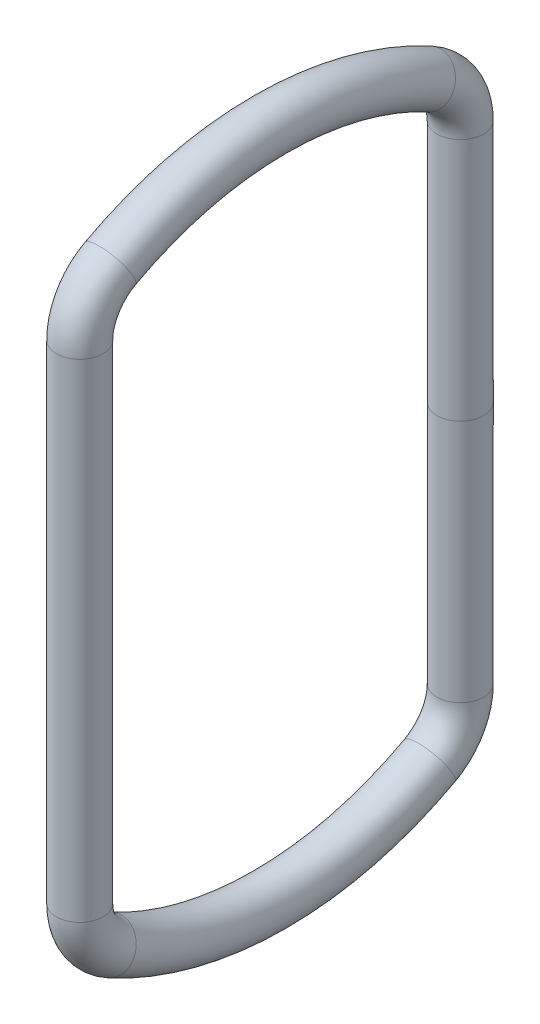
ISO-10303-21;
HEADER;
FILE_DESCRIPTION(('STEP AP214'),'2;1');
FILE_NAME('part.step','',(''),(''),'','','');
FILE_SCHEMA(('AUTOMOTIVE_DESIGN { 1 0 10303 214 1 1 1 1 }'));
ENDSEC;
DATA;
#1=APPLICATION_CONTEXT('core data for automotive mechanical design processes');
#2=APPLICATION_PROTOCOL_DEFINITION('international standard','automotive_design',2000,#1);
#3=PRODUCT_CONTEXT('',#1,'mechanical');
#4=PRODUCT('Part','Part','',(#3));
#5=PRODUCT_RELATED_PRODUCT_CATEGORY('part','',(#4));
#6=PRODUCT_DEFINITION_FORMATION('','',#4);
#7=PRODUCT_DEFINITION_CONTEXT('part definition',#1,'design');
#8=PRODUCT_DEFINITION('design','',#6,#7);
#9=PRODUCT_DEFINITION_SHAPE('','',#8);
#10=(LENGTH_UNIT() NAMED_UNIT(*) SI_UNIT(.MILLI.,.METRE.));
#11=(NAMED_UNIT(*) PLANE_ANGLE_UNIT() SI_UNIT($,.RADIAN.));
#12=(NAMED_UNIT(*) SI_UNIT($,.STERADIAN.) SOLID_ANGLE_UNIT());
#13=UNCERTAINTY_MEASURE_WITH_UNIT(LENGTH_MEASURE(1.E-05),#10,'distance_accuracy_value','');
#14=(GEOMETRIC_REPRESENTATION_CONTEXT(3) GLOBAL_UNCERTAINTY_ASSIGNED_CONTEXT((#13)) GLOBAL_UNIT_ASSIGNED_CONTEXT((#10,
#11,#12)) REPRESENTATION_CONTEXT('',''));
#15=CARTESIAN_POINT('',(0.,0.,0.));
#16=DIRECTION('',(0.,0.,1.));
#17=DIRECTION('',(1.,0.,0.));
#18=AXIS2_PLACEMENT_3D('',#15,#16,#17);
#19=CARTESIAN_POINT('',(0.,-4.17790617414992,-3.26));
#20=DIRECTION('',(0.,1.,0.));
#21=DIRECTION('',(0.,0.,1.));
#22=AXIS2_PLACEMENT_3D('',#19,#20,#21);
#23=CYLINDRICAL_SURFACE('',#22,0.4);
#24=CARTESIAN_POINT('',(0.,0.,-3.26));
#25=DIRECTION('',(0.,1.,0.));
#26=DIRECTION('',(0.,0.,1.));
#27=AXIS2_PLACEMENT_3D('',#24,#25,#26);
#28=CIRCLE('',#27,0.4);
#29=CARTESIAN_POINT('',(0.,0.,-2.86));
#30=VERTEX_POINT('',#29);
#31=EDGE_CURVE('E62',#30,#30,#28,.T.);
#32=ORIENTED_EDGE('',*,*,#31,.F.);
#33=EDGE_LOOP('',(#32));
#34=FACE_BOUND('',#33,.T.);
#35=CARTESIAN_POINT('',(0.,-4.17790617414991,-3.26));
#36=DIRECTION('',(0.,1.,0.));
#37=DIRECTION('',(0.,0.,1.));
#38=AXIS2_PLACEMENT_3D('',#35,#36,#37);
#39=CIRCLE('',#38,0.4);
#40=CARTESIAN_POINT('',(0.,-4.17790617414991,-3.66));
#41=VERTEX_POINT('',#40);
#42=EDGE_CURVE('E10',#41,#41,#39,.T.);
#43=ORIENTED_EDGE('',*,*,#42,.T.);
#44=EDGE_LOOP('',(#43));
#45=FACE_BOUND('',#44,.T.);
#46=ADVANCED_FACE('F31',(#34,#45),#23,.T.);
#47=CARTESIAN_POINT('',(0.,-4.17790617414992,-2.26));
#48=DIRECTION('',(1.,0.,0.));
#49=DIRECTION('',(0.,0.,-1.));
#50=AXIS2_PLACEMENT_3D('',#47,#48,#49);
#51=TOROIDAL_SURFACE('',#50,0.999999999999999,0.4);
#52=CARTESIAN_POINT('',(0.,-5.0574653687078,-2.73578947368421));
#53=DIRECTION('',(0.,0.47578947368421,-0.879559194557877));
#54=DIRECTION('',(0.,0.879559194557877,0.47578947368421));
#55=AXIS2_PLACEMENT_3D('',#52,#53,#54);
#56=CIRCLE('',#55,0.4);
#57=CARTESIAN_POINT('',(0.,-5.40928904653095,-2.92610526315789));
#58=VERTEX_POINT('',#57);
#59=EDGE_CURVE('E37',#58,#58,#56,.T.);
#60=CARTESIAN_POINT('',(0.,-4.17790617414992,-2.26));
#61=DIRECTION('',(1.,0.,0.));
#62=DIRECTION('',(0.,0.,-1.));
#63=AXIS2_PLACEMENT_3D('',#60,#61,#62);
#64=CIRCLE('',#63,1.4);
#65=EDGE_CURVE('',#58,#41,#64,.T.);
#66=ORIENTED_EDGE('',*,*,#59,.T.);
#67=ORIENTED_EDGE('',*,*,#42,.F.);
#68=ORIENTED_EDGE('',*,*,#65,.T.);
#69=ORIENTED_EDGE('',*,*,#65,.F.);
#70=EDGE_LOOP('',(#66,#68,#67,#69));
#71=FACE_BOUND('',#70,.T.);
#72=ADVANCED_FACE('F69',(#71),#51,.T.);
#73=CARTESIAN_POINT('',(0.,0.,0.));
#74=DIRECTION('',(1.,0.,0.));
#75=DIRECTION('',(0.,0.,-1.));
#76=AXIS2_PLACEMENT_3D('',#73,#74,#75);
#77=TOROIDAL_SURFACE('',#76,5.75,0.4);
#78=CARTESIAN_POINT('',(0.,-5.05746536870779,2.73578947368422));
#79=DIRECTION('',(0.,-0.475789473684216,-0.879559194557875));
#80=DIRECTION('',(0.,0.879559194557875,-0.475789473684216));
#81=AXIS2_PLACEMENT_3D('',#78,#79,#80);
#82=CIRCLE('',#81,0.4);
#83=CARTESIAN_POINT('',(0.,-5.40928904653094,2.9261052631579));
#84=VERTEX_POINT('',#83);
#85=EDGE_CURVE('E41',#84,#84,#82,.T.);
#86=CARTESIAN_POINT('',(0.,0.,0.));
#87=DIRECTION('',(1.,0.,0.));
#88=DIRECTION('',(0.,0.,-1.));
#89=AXIS2_PLACEMENT_3D('',#86,#87,#88);
#90=CIRCLE('',#89,6.15);
#91=EDGE_CURVE('',#84,#58,#90,.T.);
#92=ORIENTED_EDGE('',*,*,#85,.T.);
#93=ORIENTED_EDGE('',*,*,#59,.F.);
#94=ORIENTED_EDGE('',*,*,#91,.T.);
#95=ORIENTED_EDGE('',*,*,#91,.F.);
#96=EDGE_LOOP('',(#92,#94,#93,#95));
#97=FACE_BOUND('',#96,.T.);
#98=ADVANCED_FACE('F73',(#97),#77,.T.);
#99=CARTESIAN_POINT('',(0.,-4.17790617414992,2.26));
#100=DIRECTION('',(1.,0.,0.));
#101=DIRECTION('',(0.,0.,-1.));
#102=AXIS2_PLACEMENT_3D('',#99,#100,#101);
#103=TOROIDAL_SURFACE('',#102,1.,0.4);
#104=CARTESIAN_POINT('',(0.,-4.17790617414992,3.26));
#105=DIRECTION('',(0.,-1.,0.));
#106=DIRECTION('',(0.,0.,-1.));
#107=AXIS2_PLACEMENT_3D('',#104,#105,#106);
#108=CIRCLE('',#107,0.4);
#109=CARTESIAN_POINT('',(0.,-4.17790617414992,3.66));
#110=VERTEX_POINT('',#109);
#111=EDGE_CURVE('E45',#110,#110,#108,.T.);
#112=CARTESIAN_POINT('',(0.,-4.17790617414992,2.26));
#113=DIRECTION('',(1.,0.,0.));
#114=DIRECTION('',(0.,0.,-1.));
#115=AXIS2_PLACEMENT_3D('',#112,#113,#114);
#116=CIRCLE('',#115,1.4);
#117=EDGE_CURVE('',#110,#84,#116,.T.);
#118=ORIENTED_EDGE('',*,*,#111,.T.);
#119=ORIENTED_EDGE('',*,*,#85,.F.);
#120=ORIENTED_EDGE('',*,*,#117,.T.);
#121=ORIENTED_EDGE('',*,*,#117,.F.);
#122=EDGE_LOOP('',(#118,#120,#119,#121));
#123=FACE_BOUND('',#122,.T.);
#124=ADVANCED_FACE('F78',(#123),#103,.T.);
#125=CARTESIAN_POINT('',(0.,4.17790617414992,3.26));
#126=DIRECTION('',(0.,-1.,0.));
#127=DIRECTION('',(0.,0.,-1.));
#128=AXIS2_PLACEMENT_3D('',#125,#126,#127);
#129=CYLINDRICAL_SURFACE('',#128,0.4);
#130=ORIENTED_EDGE('',*,*,#111,.F.);
#131=EDGE_LOOP('',(#130));
#132=FACE_BOUND('',#131,.T.);
#133=CARTESIAN_POINT('',(0.,4.17790617414992,3.26));
#134=DIRECTION('',(0.,-1.,0.));
#135=DIRECTION('',(0.,0.,-1.));
#136=AXIS2_PLACEMENT_3D('',#133,#134,#135);
#137=CIRCLE('',#136,0.4);
#138=CARTESIAN_POINT('',(0.,4.17790617414992,3.66));
#139=VERTEX_POINT('',#138);
#140=EDGE_CURVE('E50',#139,#139,#137,.T.);
#141=ORIENTED_EDGE('',*,*,#140,.T.);
#142=EDGE_LOOP('',(#141));
#143=FACE_BOUND('',#142,.T.);
#144=ADVANCED_FACE('F84',(#132,#143),#129,.T.);
#145=CARTESIAN_POINT('',(0.,4.17790617414992,2.26));
#146=DIRECTION('',(1.,0.,0.));
#147=DIRECTION('',(0.,0.,-1.));
#148=AXIS2_PLACEMENT_3D('',#145,#146,#147);
#149=TOROIDAL_SURFACE('',#148,1.,0.4);
#150=CARTESIAN_POINT('',(0.,5.0574653687078,2.73578947368421));
#151=DIRECTION('',(0.,-0.47578947368421,0.879559194557877));
#152=DIRECTION('',(0.,-0.879559194557877,-0.47578947368421));
#153=AXIS2_PLACEMENT_3D('',#150,#151,#152);
#154=CIRCLE('',#153,0.4);
#155=CARTESIAN_POINT('',(0.,5.40928904653095,2.92610526315789));
#156=VERTEX_POINT('',#155);
#157=EDGE_CURVE('E53',#156,#156,#154,.T.);
#158=CARTESIAN_POINT('',(0.,4.17790617414992,2.26));
#159=DIRECTION('',(1.,0.,0.));
#160=DIRECTION('',(0.,0.,-1.));
#161=AXIS2_PLACEMENT_3D('',#158,#159,#160);
#162=CIRCLE('',#161,1.4);
#163=EDGE_CURVE('',#156,#139,#162,.T.);
#164=ORIENTED_EDGE('',*,*,#157,.T.);
#165=ORIENTED_EDGE('',*,*,#140,.F.);
#166=ORIENTED_EDGE('',*,*,#163,.T.);
#167=ORIENTED_EDGE('',*,*,#163,.F.);
#168=EDGE_LOOP('',(#164,#166,#165,#167));
#169=FACE_BOUND('',#168,.T.);
#170=ADVANCED_FACE('F88',(#169),#149,.T.);
#171=CARTESIAN_POINT('',(0.,0.,0.));
#172=DIRECTION('',(1.,0.,0.));
#173=DIRECTION('',(0.,0.,-1.));
#174=AXIS2_PLACEMENT_3D('',#171,#172,#173);
#175=TOROIDAL_SURFACE('',#174,5.75,0.4);
#176=CARTESIAN_POINT('',(0.,5.05746536870779,-2.73578947368422));
#177=DIRECTION('',(0.,0.475789473684217,0.879559194557874));
#178=DIRECTION('',(0.,-0.879559194557874,0.475789473684217));
#179=AXIS2_PLACEMENT_3D('',#176,#177,#178);
#180=CIRCLE('',#179,0.4);
#181=CARTESIAN_POINT('',(0.,5.40928904653094,-2.9261052631579));
#182=VERTEX_POINT('',#181);
#183=EDGE_CURVE('E56',#182,#182,#180,.T.);
#184=CARTESIAN_POINT('',(0.,0.,0.));
#185=DIRECTION('',(1.,0.,0.));
#186=DIRECTION('',(0.,0.,-1.));
#187=AXIS2_PLACEMENT_3D('',#184,#185,#186);
#188=CIRCLE('',#187,6.15);
#189=EDGE_CURVE('',#182,#156,#188,.T.);
#190=ORIENTED_EDGE('',*,*,#183,.T.);
#191=ORIENTED_EDGE('',*,*,#157,.F.);
#192=ORIENTED_EDGE('',*,*,#189,.T.);
#193=ORIENTED_EDGE('',*,*,#189,.F.);
#194=EDGE_LOOP('',(#190,#192,#191,#193));
#195=FACE_BOUND('',#194,.T.);
#196=ADVANCED_FACE('F92',(#195),#175,.T.);
#197=CARTESIAN_POINT('',(0.,4.17790617414992,-2.26));
#198=DIRECTION('',(1.,0.,0.));
#199=DIRECTION('',(0.,0.,-1.));
#200=AXIS2_PLACEMENT_3D('',#197,#198,#199);
#201=TOROIDAL_SURFACE('',#200,1.,0.4);
#202=CARTESIAN_POINT('',(0.,4.17790617414992,-3.26));
#203=DIRECTION('',(0.,1.,0.));
#204=DIRECTION('',(0.,0.,1.));
#205=AXIS2_PLACEMENT_3D('',#202,#203,#204);
#206=CIRCLE('',#205,0.4);
#207=CARTESIAN_POINT('',(0.,4.17790617414992,-3.66));
#208=VERTEX_POINT('',#207);
#209=EDGE_CURVE('E59',#208,#208,#206,.T.);
#210=CARTESIAN_POINT('',(0.,4.17790617414992,-2.26));
#211=DIRECTION('',(1.,0.,0.));
#212=DIRECTION('',(0.,0.,-1.));
#213=AXIS2_PLACEMENT_3D('',#210,#211,#212);
#214=CIRCLE('',#213,1.4);
#215=EDGE_CURVE('',#208,#182,#214,.T.);
#216=ORIENTED_EDGE('',*,*,#209,.T.);
#217=ORIENTED_EDGE('',*,*,#183,.F.);
#218=ORIENTED_EDGE('',*,*,#215,.T.);
#219=ORIENTED_EDGE('',*,*,#215,.F.);
#220=EDGE_LOOP('',(#216,#218,#217,#219));
#221=FACE_BOUND('',#220,.T.);
#222=ADVANCED_FACE('F96',(#221),#201,.T.);
#223=CARTESIAN_POINT('',(0.,0.,-3.26));
#224=DIRECTION('',(0.,1.,0.));
#225=DIRECTION('',(0.,0.,1.));
#226=AXIS2_PLACEMENT_3D('',#223,#224,#225);
#227=CYLINDRICAL_SURFACE('',#226,0.4);
#228=ORIENTED_EDGE('',*,*,#209,.F.);
#229=EDGE_LOOP('',(#228));
#230=FACE_BOUND('',#229,.T.);
#231=ORIENTED_EDGE('',*,*,#31,.T.);
#232=EDGE_LOOP('',(#231));
#233=FACE_BOUND('',#232,.T.);
#234=ADVANCED_FACE('F66',(#230,#233),#227,.T.);
#235=CLOSED_SHELL('',(#46,#72,#98,#124,#144,#170,#196,#222,#234));
#236=MANIFOLD_SOLID_BREP('B2',#235);
#237=ADVANCED_BREP_SHAPE_REPRESENTATION('',(#18,#236),#14);
#238=SHAPE_DEFINITION_REPRESENTATION(#9,#237);
ENDSEC;
END-ISO-10303-21;
